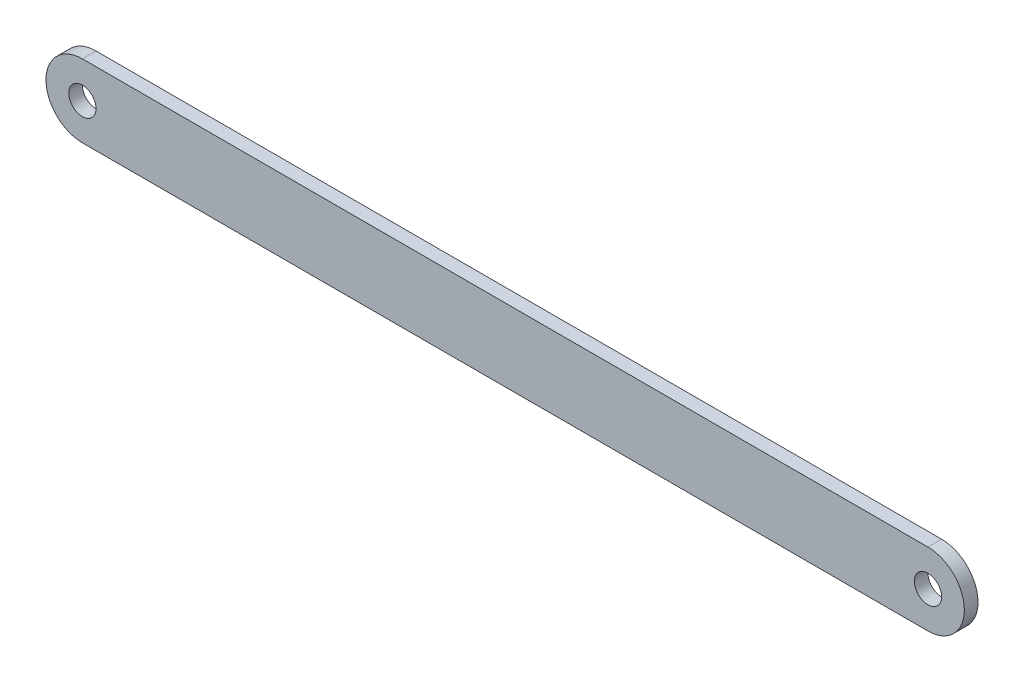
ISO-10303-21;
HEADER;
FILE_DESCRIPTION(('STEP AP214'),'2;1');
FILE_NAME('part.step','',(''),(''),'','','');
FILE_SCHEMA(('AUTOMOTIVE_DESIGN { 1 0 10303 214 1 1 1 1 }'));
ENDSEC;
DATA;
#1=APPLICATION_CONTEXT('core data for automotive mechanical design processes');
#2=APPLICATION_PROTOCOL_DEFINITION('international standard','automotive_design',2000,#1);
#3=PRODUCT_CONTEXT('',#1,'mechanical');
#4=PRODUCT('Part','Part','',(#3));
#5=PRODUCT_RELATED_PRODUCT_CATEGORY('part','',(#4));
#6=PRODUCT_DEFINITION_FORMATION('','',#4);
#7=PRODUCT_DEFINITION_CONTEXT('part definition',#1,'design');
#8=PRODUCT_DEFINITION('design','',#6,#7);
#9=PRODUCT_DEFINITION_SHAPE('','',#8);
#10=(LENGTH_UNIT() NAMED_UNIT(*) SI_UNIT(.MILLI.,.METRE.));
#11=(NAMED_UNIT(*) PLANE_ANGLE_UNIT() SI_UNIT($,.RADIAN.));
#12=(NAMED_UNIT(*) SI_UNIT($,.STERADIAN.) SOLID_ANGLE_UNIT());
#13=UNCERTAINTY_MEASURE_WITH_UNIT(LENGTH_MEASURE(1.E-05),#10,'distance_accuracy_value','');
#14=(GEOMETRIC_REPRESENTATION_CONTEXT(3) GLOBAL_UNCERTAINTY_ASSIGNED_CONTEXT((#13)) GLOBAL_UNIT_ASSIGNED_CONTEXT((#10,
#11,#12)) REPRESENTATION_CONTEXT('',''));
#15=CARTESIAN_POINT('',(0.,0.,0.));
#16=DIRECTION('',(0.,0.,1.));
#17=DIRECTION('',(1.,0.,0.));
#18=AXIS2_PLACEMENT_3D('',#15,#16,#17);
#19=CARTESIAN_POINT('',(0.,-8.00000000000001,3.));
#20=DIRECTION('',(0.,1.,0.));
#21=DIRECTION('',(0.,0.,1.));
#22=AXIS2_PLACEMENT_3D('',#19,#20,#21);
#23=PLANE('',#22);
#24=DIRECTION('',(1.,0.,0.));
#25=VECTOR('',#24,1.);
#26=CARTESIAN_POINT('',(0.,-8.00000000000001,0.));
#27=LINE('',#26,#25);
#28=CARTESIAN_POINT('',(-93.,-8.,0.));
#29=VERTEX_POINT('',#28);
#30=CARTESIAN_POINT('',(93.,-8.,0.));
#31=VERTEX_POINT('',#30);
#32=EDGE_CURVE('E109',#29,#31,#27,.T.);
#33=ORIENTED_EDGE('',*,*,#32,.T.);
#34=DIRECTION('',(0.,0.,-1.));
#35=VECTOR('',#34,1.);
#36=CARTESIAN_POINT('',(93.,-8.,3.));
#37=LINE('',#36,#35);
#38=CARTESIAN_POINT('',(93.,-8.,3.));
#39=VERTEX_POINT('',#38);
#40=EDGE_CURVE('E11',#39,#31,#37,.T.);
#41=ORIENTED_EDGE('',*,*,#40,.F.);
#42=DIRECTION('',(1.,0.,0.));
#43=VECTOR('',#42,1.);
#44=CARTESIAN_POINT('',(0.,-8.00000000000001,3.));
#45=LINE('',#44,#43);
#46=CARTESIAN_POINT('',(-93.,-8.,3.));
#47=VERTEX_POINT('',#46);
#48=EDGE_CURVE('E88',#47,#39,#45,.T.);
#49=ORIENTED_EDGE('',*,*,#48,.F.);
#50=DIRECTION('',(0.,0.,-1.));
#51=VECTOR('',#50,1.);
#52=CARTESIAN_POINT('',(-93.,-8.,3.));
#53=LINE('',#52,#51);
#54=EDGE_CURVE('E108',#47,#29,#53,.T.);
#55=ORIENTED_EDGE('',*,*,#54,.T.);
#56=EDGE_LOOP('',(#33,#41,#49,#55));
#57=FACE_BOUND('',#56,.T.);
#58=ADVANCED_FACE('F40',(#57),#23,.F.);
#59=CARTESIAN_POINT('',(93.,0.,3.));
#60=DIRECTION('',(0.,0.,-1.));
#61=DIRECTION('',(-1.,0.,0.));
#62=AXIS2_PLACEMENT_3D('',#59,#60,#61);
#63=CYLINDRICAL_SURFACE('',#62,8.);
#64=CARTESIAN_POINT('',(93.,0.,0.));
#65=DIRECTION('',(0.,0.,1.));
#66=DIRECTION('',(1.,0.,0.));
#67=AXIS2_PLACEMENT_3D('',#64,#65,#66);
#68=CIRCLE('',#67,8.);
#69=CARTESIAN_POINT('',(93.,7.99999999999999,0.));
#70=VERTEX_POINT('',#69);
#71=EDGE_CURVE('E93',#31,#70,#68,.T.);
#72=ORIENTED_EDGE('',*,*,#71,.T.);
#73=DIRECTION('',(0.,0.,-1.));
#74=VECTOR('',#73,1.);
#75=CARTESIAN_POINT('',(93.,7.99999999999999,3.));
#76=LINE('',#75,#74);
#77=CARTESIAN_POINT('',(93.,7.99999999999999,3.));
#78=VERTEX_POINT('',#77);
#79=EDGE_CURVE('E48',#78,#70,#76,.T.);
#80=ORIENTED_EDGE('',*,*,#79,.F.);
#81=CARTESIAN_POINT('',(93.,0.,3.));
#82=DIRECTION('',(0.,0.,1.));
#83=DIRECTION('',(1.,0.,0.));
#84=AXIS2_PLACEMENT_3D('',#81,#82,#83);
#85=CIRCLE('',#84,8.);
#86=EDGE_CURVE('E82',#39,#78,#85,.T.);
#87=ORIENTED_EDGE('',*,*,#86,.F.);
#88=ORIENTED_EDGE('',*,*,#40,.T.);
#89=EDGE_LOOP('',(#72,#80,#87,#88));
#90=FACE_BOUND('',#89,.T.);
#91=ADVANCED_FACE('F92',(#90),#63,.T.);
#92=CARTESIAN_POINT('',(0.,7.99999999999999,3.));
#93=DIRECTION('',(0.,1.,0.));
#94=DIRECTION('',(0.,0.,1.));
#95=AXIS2_PLACEMENT_3D('',#92,#93,#94);
#96=PLANE('',#95);
#97=DIRECTION('',(1.,0.,0.));
#98=VECTOR('',#97,1.);
#99=CARTESIAN_POINT('',(0.,7.99999999999999,0.));
#100=LINE('',#99,#98);
#101=CARTESIAN_POINT('',(-93.,7.99999999999999,0.));
#102=VERTEX_POINT('',#101);
#103=EDGE_CURVE('E113',#102,#70,#100,.T.);
#104=ORIENTED_EDGE('',*,*,#103,.F.);
#105=DIRECTION('',(0.,0.,-1.));
#106=VECTOR('',#105,1.);
#107=CARTESIAN_POINT('',(-93.,7.99999999999999,3.));
#108=LINE('',#107,#106);
#109=CARTESIAN_POINT('',(-93.,7.99999999999999,3.));
#110=VERTEX_POINT('',#109);
#111=EDGE_CURVE('E72',#110,#102,#108,.T.);
#112=ORIENTED_EDGE('',*,*,#111,.F.);
#113=DIRECTION('',(1.,0.,0.));
#114=VECTOR('',#113,1.);
#115=CARTESIAN_POINT('',(0.,7.99999999999999,3.));
#116=LINE('',#115,#114);
#117=EDGE_CURVE('E86',#110,#78,#116,.T.);
#118=ORIENTED_EDGE('',*,*,#117,.T.);
#119=ORIENTED_EDGE('',*,*,#79,.T.);
#120=EDGE_LOOP('',(#104,#112,#118,#119));
#121=FACE_BOUND('',#120,.T.);
#122=ADVANCED_FACE('F97',(#121),#96,.T.);
#123=CARTESIAN_POINT('',(-93.,0.,3.));
#124=DIRECTION('',(0.,0.,-1.));
#125=DIRECTION('',(-1.,0.,0.));
#126=AXIS2_PLACEMENT_3D('',#123,#124,#125);
#127=CYLINDRICAL_SURFACE('',#126,3.00000000000001);
#128=CARTESIAN_POINT('',(-93.,0.,3.));
#129=DIRECTION('',(0.,0.,1.));
#130=DIRECTION('',(1.,0.,0.));
#131=AXIS2_PLACEMENT_3D('',#128,#129,#130);
#132=CIRCLE('',#131,3.00000000000001);
#133=CARTESIAN_POINT('',(-90.,0.,3.));
#134=VERTEX_POINT('',#133);
#135=EDGE_CURVE('E99',#134,#134,#132,.T.);
#136=ORIENTED_EDGE('',*,*,#135,.T.);
#137=EDGE_LOOP('',(#136));
#138=FACE_BOUND('',#137,.T.);
#139=CARTESIAN_POINT('',(-93.,0.,0.));
#140=DIRECTION('',(0.,0.,1.));
#141=DIRECTION('',(1.,0.,0.));
#142=AXIS2_PLACEMENT_3D('',#139,#140,#141);
#143=CIRCLE('',#142,3.00000000000001);
#144=CARTESIAN_POINT('',(-90.,0.,0.));
#145=VERTEX_POINT('',#144);
#146=EDGE_CURVE('E116',#145,#145,#143,.T.);
#147=ORIENTED_EDGE('',*,*,#146,.F.);
#148=EDGE_LOOP('',(#147));
#149=FACE_BOUND('',#148,.T.);
#150=ADVANCED_FACE('F144',(#138,#149),#127,.F.);
#151=CARTESIAN_POINT('',(-93.,0.,3.));
#152=DIRECTION('',(0.,0.,-1.));
#153=DIRECTION('',(-1.,0.,0.));
#154=AXIS2_PLACEMENT_3D('',#151,#152,#153);
#155=CYLINDRICAL_SURFACE('',#154,8.);
#156=CARTESIAN_POINT('',(-93.,0.,0.));
#157=DIRECTION('',(0.,0.,1.));
#158=DIRECTION('',(1.,0.,0.));
#159=AXIS2_PLACEMENT_3D('',#156,#157,#158);
#160=CIRCLE('',#159,8.);
#161=EDGE_CURVE('E75',#102,#29,#160,.T.);
#162=ORIENTED_EDGE('',*,*,#161,.T.);
#163=ORIENTED_EDGE('',*,*,#54,.F.);
#164=CARTESIAN_POINT('',(-93.,0.,3.));
#165=DIRECTION('',(0.,0.,1.));
#166=DIRECTION('',(1.,0.,0.));
#167=AXIS2_PLACEMENT_3D('',#164,#165,#166);
#168=CIRCLE('',#167,8.);
#169=EDGE_CURVE('E56',#110,#47,#168,.T.);
#170=ORIENTED_EDGE('',*,*,#169,.F.);
#171=ORIENTED_EDGE('',*,*,#111,.T.);
#172=EDGE_LOOP('',(#162,#163,#170,#171));
#173=FACE_BOUND('',#172,.T.);
#174=ADVANCED_FACE('F136',(#173),#155,.T.);
#175=CARTESIAN_POINT('',(93.,0.,3.));
#176=DIRECTION('',(0.,0.,-1.));
#177=DIRECTION('',(-1.,0.,0.));
#178=AXIS2_PLACEMENT_3D('',#175,#176,#177);
#179=CYLINDRICAL_SURFACE('',#178,3.00000000000001);
#180=CARTESIAN_POINT('',(93.,0.,3.));
#181=DIRECTION('',(0.,0.,1.));
#182=DIRECTION('',(1.,0.,0.));
#183=AXIS2_PLACEMENT_3D('',#180,#181,#182);
#184=CIRCLE('',#183,3.00000000000001);
#185=CARTESIAN_POINT('',(96.,0.,3.));
#186=VERTEX_POINT('',#185);
#187=EDGE_CURVE('E105',#186,#186,#184,.T.);
#188=ORIENTED_EDGE('',*,*,#187,.T.);
#189=EDGE_LOOP('',(#188));
#190=FACE_BOUND('',#189,.T.);
#191=CARTESIAN_POINT('',(93.,0.,0.));
#192=DIRECTION('',(0.,0.,1.));
#193=DIRECTION('',(1.,0.,0.));
#194=AXIS2_PLACEMENT_3D('',#191,#192,#193);
#195=CIRCLE('',#194,3.00000000000001);
#196=CARTESIAN_POINT('',(96.,0.,0.));
#197=VERTEX_POINT('',#196);
#198=EDGE_CURVE('E119',#197,#197,#195,.T.);
#199=ORIENTED_EDGE('',*,*,#198,.F.);
#200=EDGE_LOOP('',(#199));
#201=FACE_BOUND('',#200,.T.);
#202=ADVANCED_FACE('F134',(#190,#201),#179,.F.);
#203=CARTESIAN_POINT('',(0.,0.,3.));
#204=DIRECTION('',(0.,0.,1.));
#205=DIRECTION('',(1.,0.,0.));
#206=AXIS2_PLACEMENT_3D('',#203,#204,#205);
#207=PLANE('',#206);
#208=ORIENTED_EDGE('',*,*,#48,.T.);
#209=ORIENTED_EDGE('',*,*,#86,.T.);
#210=ORIENTED_EDGE('',*,*,#117,.F.);
#211=ORIENTED_EDGE('',*,*,#169,.T.);
#212=EDGE_LOOP('',(#208,#209,#210,#211));
#213=FACE_BOUND('',#212,.T.);
#214=ORIENTED_EDGE('',*,*,#135,.F.);
#215=EDGE_LOOP('',(#214));
#216=FACE_BOUND('',#215,.T.);
#217=ORIENTED_EDGE('',*,*,#187,.F.);
#218=EDGE_LOOP('',(#217));
#219=FACE_BOUND('',#218,.T.);
#220=ADVANCED_FACE('F83',(#213,#216,#219),#207,.T.);
#221=CARTESIAN_POINT('',(0.,0.,0.));
#222=DIRECTION('',(0.,0.,1.));
#223=DIRECTION('',(1.,0.,0.));
#224=AXIS2_PLACEMENT_3D('',#221,#222,#223);
#225=PLANE('',#224);
#226=ORIENTED_EDGE('',*,*,#32,.F.);
#227=ORIENTED_EDGE('',*,*,#161,.F.);
#228=ORIENTED_EDGE('',*,*,#103,.T.);
#229=ORIENTED_EDGE('',*,*,#71,.F.);
#230=EDGE_LOOP('',(#226,#227,#228,#229));
#231=FACE_BOUND('',#230,.T.);
#232=ORIENTED_EDGE('',*,*,#146,.T.);
#233=EDGE_LOOP('',(#232));
#234=FACE_BOUND('',#233,.T.);
#235=ORIENTED_EDGE('',*,*,#198,.T.);
#236=EDGE_LOOP('',(#235));
#237=FACE_BOUND('',#236,.T.);
#238=ADVANCED_FACE('F126',(#231,#234,#237),#225,.F.);
#239=CLOSED_SHELL('',(#58,#91,#122,#150,#174,#202,#220,#238));
#240=MANIFOLD_SOLID_BREP('B2',#239);
#241=ADVANCED_BREP_SHAPE_REPRESENTATION('',(#18,#240),#14);
#242=SHAPE_DEFINITION_REPRESENTATION(#9,#241);
ENDSEC;
END-ISO-10303-21;
